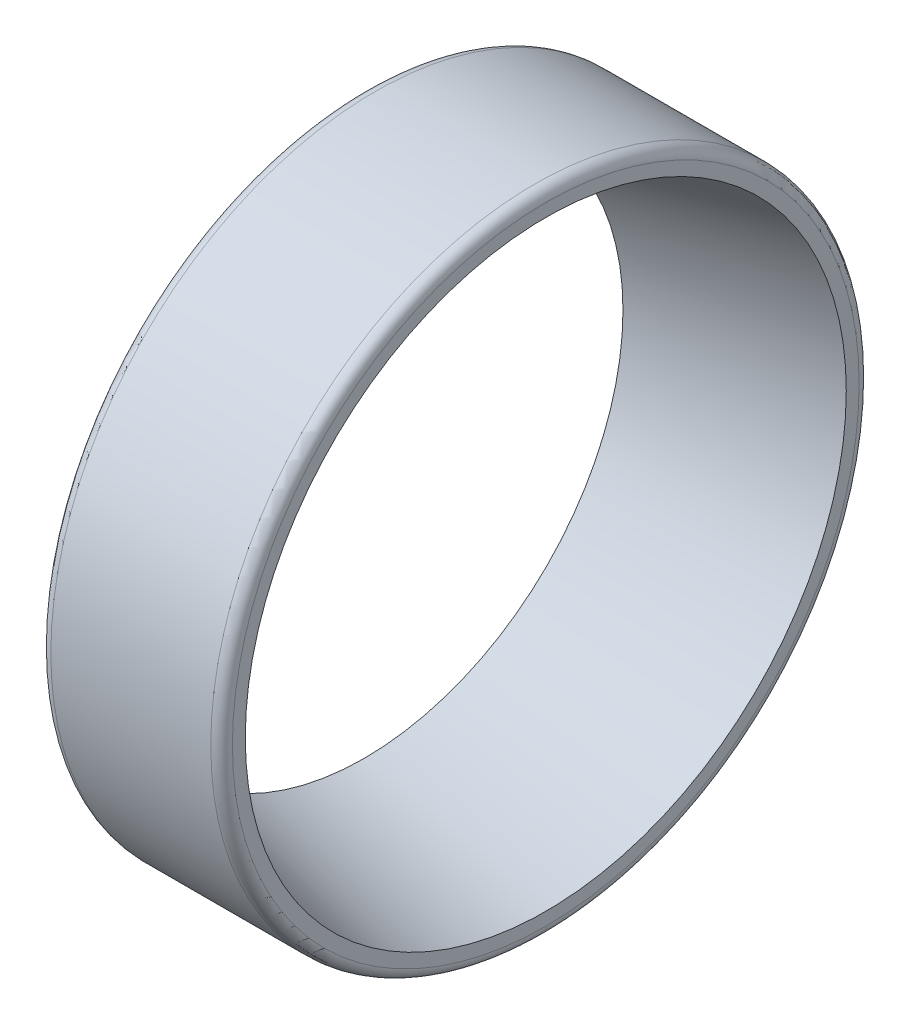
ISO-10303-21;
HEADER;
FILE_DESCRIPTION(('STEP AP214'),'2;1');
FILE_NAME('part.step','',(''),(''),'','','');
FILE_SCHEMA(('AUTOMOTIVE_DESIGN { 1 0 10303 214 1 1 1 1 }'));
ENDSEC;
DATA;
#1=APPLICATION_CONTEXT('core data for automotive mechanical design processes');
#2=APPLICATION_PROTOCOL_DEFINITION('international standard','automotive_design',2000,#1);
#3=PRODUCT_CONTEXT('',#1,'mechanical');
#4=PRODUCT('Part','Part','',(#3));
#5=PRODUCT_RELATED_PRODUCT_CATEGORY('part','',(#4));
#6=PRODUCT_DEFINITION_FORMATION('','',#4);
#7=PRODUCT_DEFINITION_CONTEXT('part definition',#1,'design');
#8=PRODUCT_DEFINITION('design','',#6,#7);
#9=PRODUCT_DEFINITION_SHAPE('','',#8);
#10=(LENGTH_UNIT() NAMED_UNIT(*) SI_UNIT(.MILLI.,.METRE.));
#11=(NAMED_UNIT(*) PLANE_ANGLE_UNIT() SI_UNIT($,.RADIAN.));
#12=(NAMED_UNIT(*) SI_UNIT($,.STERADIAN.) SOLID_ANGLE_UNIT());
#13=UNCERTAINTY_MEASURE_WITH_UNIT(LENGTH_MEASURE(1.E-05),#10,'distance_accuracy_value','');
#14=(GEOMETRIC_REPRESENTATION_CONTEXT(3) GLOBAL_UNCERTAINTY_ASSIGNED_CONTEXT((#13)) GLOBAL_UNIT_ASSIGNED_CONTEXT((#10,
#11,#12)) REPRESENTATION_CONTEXT('',''));
#15=CARTESIAN_POINT('',(0.,0.,0.));
#16=DIRECTION('',(0.,0.,1.));
#17=DIRECTION('',(1.,0.,0.));
#18=AXIS2_PLACEMENT_3D('',#15,#16,#17);
#19=CARTESIAN_POINT('',(-51.4999999999987,0.,0.));
#20=DIRECTION('',(1.,0.,0.));
#21=DIRECTION('',(0.,0.,-1.));
#22=AXIS2_PLACEMENT_3D('',#19,#20,#21);
#23=TOROIDAL_SURFACE('',#22,72.4999999999988,2.50000000000125);
#24=CARTESIAN_POINT('',(-54.,0.,0.));
#25=DIRECTION('',(1.,0.,0.));
#26=DIRECTION('',(0.,0.,-1.));
#27=AXIS2_PLACEMENT_3D('',#24,#25,#26);
#28=CIRCLE('',#27,72.4999999999988);
#29=CARTESIAN_POINT('',(-54.,0.,-72.4999999999988));
#30=VERTEX_POINT('',#29);
#31=EDGE_CURVE('E38',#30,#30,#28,.T.);
#32=ORIENTED_EDGE('',*,*,#31,.T.);
#33=EDGE_LOOP('',(#32));
#34=FACE_BOUND('',#33,.T.);
#35=CARTESIAN_POINT('',(-51.5,0.,0.));
#36=DIRECTION('',(1.,0.,0.));
#37=DIRECTION('',(0.,0.,-1.));
#38=AXIS2_PLACEMENT_3D('',#35,#36,#37);
#39=CIRCLE('',#38,75.);
#40=CARTESIAN_POINT('',(-51.5,0.,-75.));
#41=VERTEX_POINT('',#40);
#42=EDGE_CURVE('E35',#41,#41,#39,.T.);
#43=ORIENTED_EDGE('',*,*,#42,.F.);
#44=EDGE_LOOP('',(#43));
#45=FACE_BOUND('',#44,.T.);
#46=ADVANCED_FACE('F15',(#34,#45),#23,.T.);
#47=CARTESIAN_POINT('',(-54.,72.5,0.));
#48=DIRECTION('',(-1.,0.,0.));
#49=DIRECTION('',(0.,0.,1.));
#50=AXIS2_PLACEMENT_3D('',#47,#48,#49);
#51=PLANE('',#50);
#52=CARTESIAN_POINT('',(-54.,0.,0.));
#53=DIRECTION('',(1.,0.,0.));
#54=DIRECTION('',(0.,0.,-1.));
#55=AXIS2_PLACEMENT_3D('',#52,#53,#54);
#56=CIRCLE('',#55,59.862);
#57=CARTESIAN_POINT('',(-54.,0.,-59.862));
#58=VERTEX_POINT('',#57);
#59=EDGE_CURVE('E30',#58,#58,#56,.T.);
#60=ORIENTED_EDGE('',*,*,#59,.T.);
#61=EDGE_LOOP('',(#60));
#62=FACE_BOUND('',#61,.T.);
#63=ORIENTED_EDGE('',*,*,#31,.F.);
#64=EDGE_LOOP('',(#63));
#65=FACE_BOUND('',#64,.T.);
#66=ADVANCED_FACE('F44',(#62,#65),#51,.T.);
#67=CARTESIAN_POINT('',(-12.,0.,0.));
#68=DIRECTION('',(1.,0.,0.));
#69=DIRECTION('',(0.,0.,-1.));
#70=AXIS2_PLACEMENT_3D('',#67,#68,#69);
#71=CYLINDRICAL_SURFACE('',#70,75.);
#72=ORIENTED_EDGE('',*,*,#42,.T.);
#73=EDGE_LOOP('',(#72));
#74=FACE_BOUND('',#73,.T.);
#75=CARTESIAN_POINT('',(-14.5,0.,0.));
#76=DIRECTION('',(1.,0.,0.));
#77=DIRECTION('',(0.,0.,-1.));
#78=AXIS2_PLACEMENT_3D('',#75,#76,#77);
#79=CIRCLE('',#78,75.);
#80=CARTESIAN_POINT('',(-14.5,0.,-75.));
#81=VERTEX_POINT('',#80);
#82=EDGE_CURVE('E26',#81,#81,#79,.T.);
#83=ORIENTED_EDGE('',*,*,#82,.F.);
#84=EDGE_LOOP('',(#83));
#85=FACE_BOUND('',#84,.T.);
#86=ADVANCED_FACE('F46',(#74,#85),#71,.T.);
#87=CARTESIAN_POINT('',(-54.,0.,0.));
#88=DIRECTION('',(1.,0.,0.));
#89=DIRECTION('',(0.,0.,-1.));
#90=AXIS2_PLACEMENT_3D('',#87,#88,#89);
#91=CONICAL_SURFACE('',#90,59.862,0.226068387993882);
#92=CARTESIAN_POINT('',(-12.,0.,0.));
#93=DIRECTION('',(1.,0.,0.));
#94=DIRECTION('',(0.,0.,-1.));
#95=AXIS2_PLACEMENT_3D('',#92,#93,#94);
#96=CIRCLE('',#95,69.5219999999999);
#97=CARTESIAN_POINT('',(-12.,0.,-69.5219999999999));
#98=VERTEX_POINT('',#97);
#99=EDGE_CURVE('E22',#98,#98,#96,.T.);
#100=ORIENTED_EDGE('',*,*,#99,.T.);
#101=EDGE_LOOP('',(#100));
#102=FACE_BOUND('',#101,.T.);
#103=ORIENTED_EDGE('',*,*,#59,.F.);
#104=EDGE_LOOP('',(#103));
#105=FACE_BOUND('',#104,.T.);
#106=ADVANCED_FACE('F54',(#102,#105),#91,.F.);
#107=CARTESIAN_POINT('',(-14.5000000000013,0.,0.));
#108=DIRECTION('',(1.,0.,0.));
#109=DIRECTION('',(0.,0.,-1.));
#110=AXIS2_PLACEMENT_3D('',#107,#108,#109);
#111=TOROIDAL_SURFACE('',#110,72.4999999999988,2.50000000000126);
#112=ORIENTED_EDGE('',*,*,#82,.T.);
#113=EDGE_LOOP('',(#112));
#114=FACE_BOUND('',#113,.T.);
#115=CARTESIAN_POINT('',(-12.,0.,0.));
#116=DIRECTION('',(1.,0.,0.));
#117=DIRECTION('',(0.,0.,-1.));
#118=AXIS2_PLACEMENT_3D('',#115,#116,#117);
#119=CIRCLE('',#118,72.5000000526824);
#120=CARTESIAN_POINT('',(-12.,0.,-72.5000000526824));
#121=VERTEX_POINT('',#120);
#122=EDGE_CURVE('E10',#121,#121,#119,.T.);
#123=ORIENTED_EDGE('',*,*,#122,.F.);
#124=EDGE_LOOP('',(#123));
#125=FACE_BOUND('',#124,.T.);
#126=ADVANCED_FACE('F60',(#114,#125),#111,.T.);
#127=CARTESIAN_POINT('',(-12.,69.522,0.));
#128=DIRECTION('',(1.,0.,0.));
#129=DIRECTION('',(0.,0.,-1.));
#130=AXIS2_PLACEMENT_3D('',#127,#128,#129);
#131=PLANE('',#130);
#132=ORIENTED_EDGE('',*,*,#122,.T.);
#133=EDGE_LOOP('',(#132));
#134=FACE_BOUND('',#133,.T.);
#135=ORIENTED_EDGE('',*,*,#99,.F.);
#136=EDGE_LOOP('',(#135));
#137=FACE_BOUND('',#136,.T.);
#138=ADVANCED_FACE('F17',(#134,#137),#131,.T.);
#139=CLOSED_SHELL('',(#46,#66,#86,#106,#126,#138));
#140=MANIFOLD_SOLID_BREP('B1',#139);
#141=ADVANCED_BREP_SHAPE_REPRESENTATION('',(#18,#140),#14);
#142=SHAPE_DEFINITION_REPRESENTATION(#9,#141);
ENDSEC;
END-ISO-10303-21;
